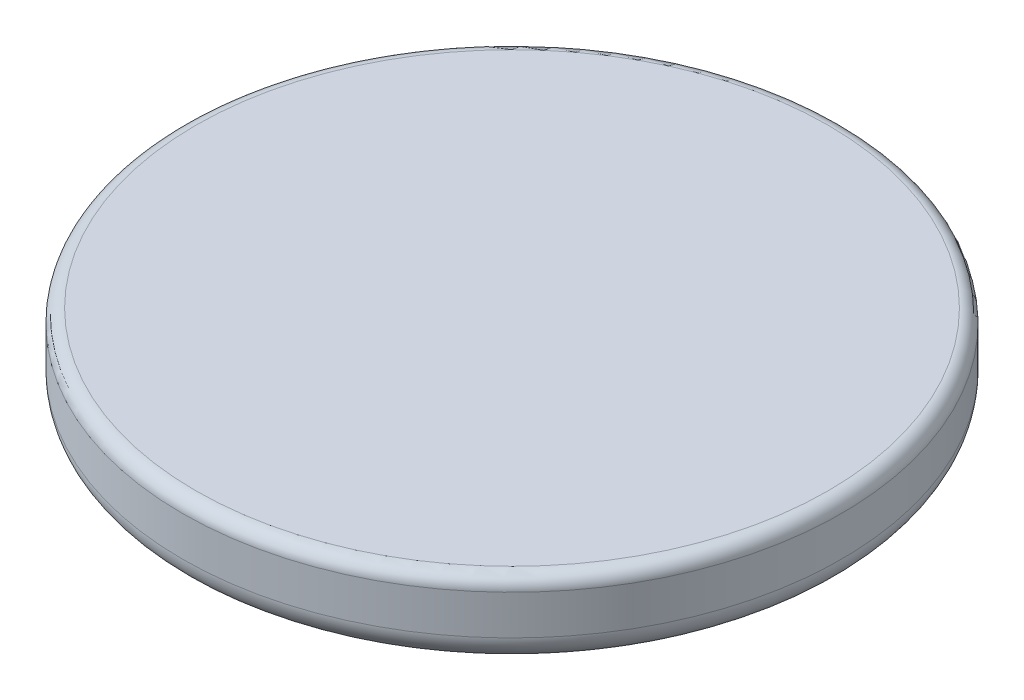
ISO-10303-21;
HEADER;
FILE_DESCRIPTION(('STEP AP214'),'2;1');
FILE_NAME('part.step','',(''),(''),'','','');
FILE_SCHEMA(('AUTOMOTIVE_DESIGN { 1 0 10303 214 1 1 1 1 }'));
ENDSEC;
DATA;
#1=APPLICATION_CONTEXT('core data for automotive mechanical design processes');
#2=APPLICATION_PROTOCOL_DEFINITION('international standard','automotive_design',2000,#1);
#3=PRODUCT_CONTEXT('',#1,'mechanical');
#4=PRODUCT('Part','Part','',(#3));
#5=PRODUCT_RELATED_PRODUCT_CATEGORY('part','',(#4));
#6=PRODUCT_DEFINITION_FORMATION('','',#4);
#7=PRODUCT_DEFINITION_CONTEXT('part definition',#1,'design');
#8=PRODUCT_DEFINITION('design','',#6,#7);
#9=PRODUCT_DEFINITION_SHAPE('','',#8);
#10=(LENGTH_UNIT() NAMED_UNIT(*) SI_UNIT(.MILLI.,.METRE.));
#11=(NAMED_UNIT(*) PLANE_ANGLE_UNIT() SI_UNIT($,.RADIAN.));
#12=(NAMED_UNIT(*) SI_UNIT($,.STERADIAN.) SOLID_ANGLE_UNIT());
#13=UNCERTAINTY_MEASURE_WITH_UNIT(LENGTH_MEASURE(1.E-05),#10,'distance_accuracy_value','');
#14=(GEOMETRIC_REPRESENTATION_CONTEXT(3) GLOBAL_UNCERTAINTY_ASSIGNED_CONTEXT((#13)) GLOBAL_UNIT_ASSIGNED_CONTEXT((#10,
#11,#12)) REPRESENTATION_CONTEXT('',''));
#15=CARTESIAN_POINT('',(0.,0.,0.));
#16=DIRECTION('',(0.,0.,1.));
#17=DIRECTION('',(1.,0.,0.));
#18=AXIS2_PLACEMENT_3D('',#15,#16,#17);
#19=CARTESIAN_POINT('',(0.,7.62,0.));
#20=DIRECTION('',(0.,-1.,0.));
#21=DIRECTION('',(0.,0.,-1.));
#22=AXIS2_PLACEMENT_3D('',#19,#20,#21);
#23=CYLINDRICAL_SURFACE('',#22,31.75);
#24=CARTESIAN_POINT('',(0.,2.54,0.));
#25=DIRECTION('',(0.,1.,0.));
#26=DIRECTION('',(0.,0.,1.));
#27=AXIS2_PLACEMENT_3D('',#24,#25,#26);
#28=CIRCLE('',#27,31.75);
#29=CARTESIAN_POINT('',(0.,2.54,-31.75));
#30=VERTEX_POINT('',#29);
#31=EDGE_CURVE('E42',#30,#30,#28,.T.);
#32=CARTESIAN_POINT('',(0.,6.35,0.));
#33=DIRECTION('',(0.,1.,0.));
#34=DIRECTION('',(0.,0.,1.));
#35=AXIS2_PLACEMENT_3D('',#32,#33,#34);
#36=CIRCLE('',#35,31.75);
#37=CARTESIAN_POINT('',(0.,6.35,-31.75));
#38=VERTEX_POINT('',#37);
#39=EDGE_CURVE('E46',#38,#38,#36,.F.);
#40=CARTESIAN_POINT('',(0.,2.54,-31.75));
#41=CARTESIAN_POINT('',(0.,2.5796875,-31.75));
#42=CARTESIAN_POINT('',(0.,2.619375,-31.75));
#43=CARTESIAN_POINT('',(0.,2.69875,-31.75));
#44=CARTESIAN_POINT('',(0.,2.7384375,-31.75));
#45=CARTESIAN_POINT('',(0.,2.8178125,-31.75));
#46=CARTESIAN_POINT('',(0.,2.8575,-31.75));
#47=CARTESIAN_POINT('',(0.,2.936875,-31.75));
#48=CARTESIAN_POINT('',(0.,2.9765625,-31.75));
#49=CARTESIAN_POINT('',(0.,3.0559375,-31.75));
#50=CARTESIAN_POINT('',(0.,3.095625,-31.75));
#51=CARTESIAN_POINT('',(0.,3.175,-31.75));
#52=CARTESIAN_POINT('',(0.,3.2146875,-31.75));
#53=CARTESIAN_POINT('',(0.,3.2940625,-31.75));
#54=CARTESIAN_POINT('',(0.,3.33375,-31.75));
#55=CARTESIAN_POINT('',(0.,3.413125,-31.75));
#56=CARTESIAN_POINT('',(0.,3.4528125,-31.75));
#57=CARTESIAN_POINT('',(0.,3.5321875,-31.75));
#58=CARTESIAN_POINT('',(0.,3.571875,-31.75));
#59=CARTESIAN_POINT('',(0.,3.65125,-31.75));
#60=CARTESIAN_POINT('',(0.,3.6909375,-31.75));
#61=CARTESIAN_POINT('',(0.,3.7703125,-31.75));
#62=CARTESIAN_POINT('',(0.,3.81,-31.75));
#63=CARTESIAN_POINT('',(0.,3.889375,-31.75));
#64=CARTESIAN_POINT('',(0.,3.9290625,-31.75));
#65=CARTESIAN_POINT('',(0.,4.0084375,-31.75));
#66=CARTESIAN_POINT('',(0.,4.048125,-31.75));
#67=CARTESIAN_POINT('',(0.,4.1275,-31.75));
#68=CARTESIAN_POINT('',(0.,4.1671875,-31.75));
#69=CARTESIAN_POINT('',(0.,4.2465625,-31.75));
#70=CARTESIAN_POINT('',(0.,4.28625,-31.75));
#71=CARTESIAN_POINT('',(0.,4.365625,-31.75));
#72=CARTESIAN_POINT('',(0.,4.4053125,-31.75));
#73=CARTESIAN_POINT('',(0.,4.4846875,-31.75));
#74=CARTESIAN_POINT('',(0.,4.524375,-31.75));
#75=CARTESIAN_POINT('',(0.,4.60375,-31.75));
#76=CARTESIAN_POINT('',(0.,4.6434375,-31.75));
#77=CARTESIAN_POINT('',(0.,4.7228125,-31.75));
#78=CARTESIAN_POINT('',(0.,4.7625,-31.75));
#79=CARTESIAN_POINT('',(0.,4.841875,-31.75));
#80=CARTESIAN_POINT('',(0.,4.8815625,-31.75));
#81=CARTESIAN_POINT('',(0.,4.9609375,-31.75));
#82=CARTESIAN_POINT('',(0.,5.000625,-31.75));
#83=CARTESIAN_POINT('',(0.,5.08,-31.75));
#84=CARTESIAN_POINT('',(0.,5.1196875,-31.75));
#85=CARTESIAN_POINT('',(0.,5.1990625,-31.75));
#86=CARTESIAN_POINT('',(0.,5.23875,-31.75));
#87=CARTESIAN_POINT('',(0.,5.318125,-31.75));
#88=CARTESIAN_POINT('',(0.,5.3578125,-31.75));
#89=CARTESIAN_POINT('',(0.,5.4371875,-31.75));
#90=CARTESIAN_POINT('',(0.,5.476875,-31.75));
#91=CARTESIAN_POINT('',(0.,5.55625,-31.75));
#92=CARTESIAN_POINT('',(0.,5.5959375,-31.75));
#93=CARTESIAN_POINT('',(0.,5.6753125,-31.75));
#94=CARTESIAN_POINT('',(0.,5.715,-31.75));
#95=CARTESIAN_POINT('',(0.,5.794375,-31.75));
#96=CARTESIAN_POINT('',(0.,5.8340625,-31.75));
#97=CARTESIAN_POINT('',(0.,5.9134375,-31.75));
#98=CARTESIAN_POINT('',(0.,5.953125,-31.75));
#99=CARTESIAN_POINT('',(0.,6.0325,-31.75));
#100=CARTESIAN_POINT('',(0.,6.0721875,-31.75));
#101=CARTESIAN_POINT('',(0.,6.1515625,-31.75));
#102=CARTESIAN_POINT('',(0.,6.19125,-31.75));
#103=CARTESIAN_POINT('',(0.,6.270625,-31.75));
#104=CARTESIAN_POINT('',(0.,6.3103125,-31.75));
#105=CARTESIAN_POINT('',(0.,6.35,-31.75));
#106=B_SPLINE_CURVE_WITH_KNOTS('',3,(#40,#41,#42,#43,#44,#45,#46,#47,#48,#49,#50,#51,#52,#53,
#54,#55,#56,#57,#58,#59,#60,#61,#62,#63,#64,#65,#66,#67,#68,#69,#70,#71,#72,#73,#74,#75,#76,#77,
#78,#79,#80,#81,#82,#83,#84,#85,#86,#87,#88,#89,#90,#91,#92,#93,#94,#95,#96,#97,#98,#99,#100,
#101,#102,#103,#104,#105),.UNSPECIFIED.,.F.,.F.,(4,2,2,2,2,2,2,2,2,2,2,2,2,2,2,2,2,2,2,2,2,2,2,
2,2,2,2,2,2,2,2,2,4),(0.,0.1190625,0.238125,0.3571875,0.47625,0.5953125,0.714375,0.8334375,
0.9525,1.0715625,1.190625,1.3096875,1.42875,1.5478125,1.666875,1.7859375,1.905,2.0240625,
2.143125,2.2621875,2.38125,2.5003125,2.619375,2.7384375,2.8575,2.9765625,3.095625,3.2146875,
3.33375,3.4528125,3.571875,3.6909375,3.81),.UNSPECIFIED.);
#107=EDGE_CURVE('BSEAM35',#30,#38,#106,.T.);
#108=ORIENTED_EDGE('',*,*,#31,.T.);
#109=ORIENTED_EDGE('',*,*,#39,.T.);
#110=ORIENTED_EDGE('',*,*,#107,.T.);
#111=ORIENTED_EDGE('',*,*,#107,.F.);
#112=EDGE_LOOP('',(#108,#110,#109,#111));
#113=FACE_BOUND('',#112,.T.);
#114=ADVANCED_FACE('F35',(#113),#23,.T.);
#115=CARTESIAN_POINT('',(0.,7.62,0.));
#116=DIRECTION('',(0.,1.,0.));
#117=DIRECTION('',(0.,0.,1.));
#118=AXIS2_PLACEMENT_3D('',#115,#116,#117);
#119=PLANE('',#118);
#120=CARTESIAN_POINT('',(0.,7.62,0.));
#121=DIRECTION('',(0.,1.,0.));
#122=DIRECTION('',(0.,0.,1.));
#123=AXIS2_PLACEMENT_3D('',#120,#121,#122);
#124=CIRCLE('',#123,30.48);
#125=CARTESIAN_POINT('',(0.,7.62,30.48));
#126=VERTEX_POINT('',#125);
#127=EDGE_CURVE('E50',#126,#126,#124,.T.);
#128=ORIENTED_EDGE('',*,*,#127,.T.);
#129=EDGE_LOOP('',(#128));
#130=FACE_BOUND('',#129,.T.);
#131=ADVANCED_FACE('F72',(#130),#119,.T.);
#132=CARTESIAN_POINT('',(0.,0.,0.));
#133=DIRECTION('',(0.,1.,0.));
#134=DIRECTION('',(0.,0.,1.));
#135=AXIS2_PLACEMENT_3D('',#132,#133,#134);
#136=PLANE('',#135);
#137=CARTESIAN_POINT('',(0.,0.,0.));
#138=DIRECTION('',(0.,1.,0.));
#139=DIRECTION('',(0.,0.,1.));
#140=AXIS2_PLACEMENT_3D('',#137,#138,#139);
#141=CIRCLE('',#140,29.21);
#142=CARTESIAN_POINT('',(0.,0.,29.21));
#143=VERTEX_POINT('',#142);
#144=EDGE_CURVE('E10',#143,#143,#141,.F.);
#145=ORIENTED_EDGE('',*,*,#144,.T.);
#146=EDGE_LOOP('',(#145));
#147=FACE_BOUND('',#146,.T.);
#148=CARTESIAN_POINT('',(0.,0.,0.));
#149=DIRECTION('',(0.,1.,0.));
#150=DIRECTION('',(0.,0.,1.));
#151=AXIS2_PLACEMENT_3D('',#148,#149,#150);
#152=CIRCLE('',#151,3.683);
#153=CARTESIAN_POINT('',(0.,0.,3.683));
#154=VERTEX_POINT('',#153);
#155=EDGE_CURVE('E55',#154,#154,#152,.F.);
#156=ORIENTED_EDGE('',*,*,#155,.F.);
#157=EDGE_LOOP('',(#156));
#158=FACE_BOUND('',#157,.T.);
#159=ADVANCED_FACE('F67',(#147,#158),#136,.F.);
#160=CARTESIAN_POINT('',(0.,-12.7,0.));
#161=DIRECTION('',(0.,1.,0.));
#162=DIRECTION('',(0.,0.,1.));
#163=AXIS2_PLACEMENT_3D('',#160,#161,#162);
#164=CYLINDRICAL_SURFACE('',#163,3.683);
#165=CARTESIAN_POINT('',(0.,-12.7,0.));
#166=DIRECTION('',(0.,-1.,0.));
#167=DIRECTION('',(0.,0.,-1.));
#168=AXIS2_PLACEMENT_3D('',#165,#166,#167);
#169=CIRCLE('',#168,3.683);
#170=CARTESIAN_POINT('',(0.,-12.7,-3.683));
#171=VERTEX_POINT('',#170);
#172=EDGE_CURVE('E58',#171,#171,#169,.T.);
#173=ORIENTED_EDGE('',*,*,#172,.F.);
#174=EDGE_LOOP('',(#173));
#175=FACE_BOUND('',#174,.T.);
#176=ORIENTED_EDGE('',*,*,#155,.T.);
#177=EDGE_LOOP('',(#176));
#178=FACE_BOUND('',#177,.T.);
#179=ADVANCED_FACE('F64',(#175,#178),#164,.T.);
#180=CARTESIAN_POINT('',(0.,-12.7,0.));
#181=DIRECTION('',(0.,-1.,0.));
#182=DIRECTION('',(0.,0.,-1.));
#183=AXIS2_PLACEMENT_3D('',#180,#181,#182);
#184=PLANE('',#183);
#185=ORIENTED_EDGE('',*,*,#172,.T.);
#186=EDGE_LOOP('',(#185));
#187=FACE_BOUND('',#186,.T.);
#188=ADVANCED_FACE('F62',(#187),#184,.T.);
#189=CARTESIAN_POINT('',(0.,6.35,0.));
#190=DIRECTION('',(0.,1.,0.));
#191=DIRECTION('',(0.,0.,1.));
#192=AXIS2_PLACEMENT_3D('',#189,#190,#191);
#193=TOROIDAL_SURFACE('',#192,30.48,1.27);
#194=ORIENTED_EDGE('',*,*,#39,.F.);
#195=EDGE_LOOP('',(#194));
#196=FACE_BOUND('',#195,.T.);
#197=ORIENTED_EDGE('',*,*,#127,.F.);
#198=EDGE_LOOP('',(#197));
#199=FACE_BOUND('',#198,.T.);
#200=ADVANCED_FACE('F84',(#196,#199),#193,.T.);
#201=CARTESIAN_POINT('',(0.,2.54,0.));
#202=DIRECTION('',(0.,1.,0.));
#203=DIRECTION('',(0.,0.,1.));
#204=AXIS2_PLACEMENT_3D('',#201,#202,#203);
#205=TOROIDAL_SURFACE('',#204,29.21,2.54);
#206=ORIENTED_EDGE('',*,*,#144,.F.);
#207=EDGE_LOOP('',(#206));
#208=FACE_BOUND('',#207,.T.);
#209=ORIENTED_EDGE('',*,*,#31,.F.);
#210=EDGE_LOOP('',(#209));
#211=FACE_BOUND('',#210,.T.);
#212=ADVANCED_FACE('F37',(#208,#211),#205,.T.);
#213=CLOSED_SHELL('',(#114,#131,#159,#179,#188,#200,#212));
#214=MANIFOLD_SOLID_BREP('B2',#213);
#215=ADVANCED_BREP_SHAPE_REPRESENTATION('',(#18,#214),#14);
#216=SHAPE_DEFINITION_REPRESENTATION(#9,#215);
ENDSEC;
END-ISO-10303-21;
